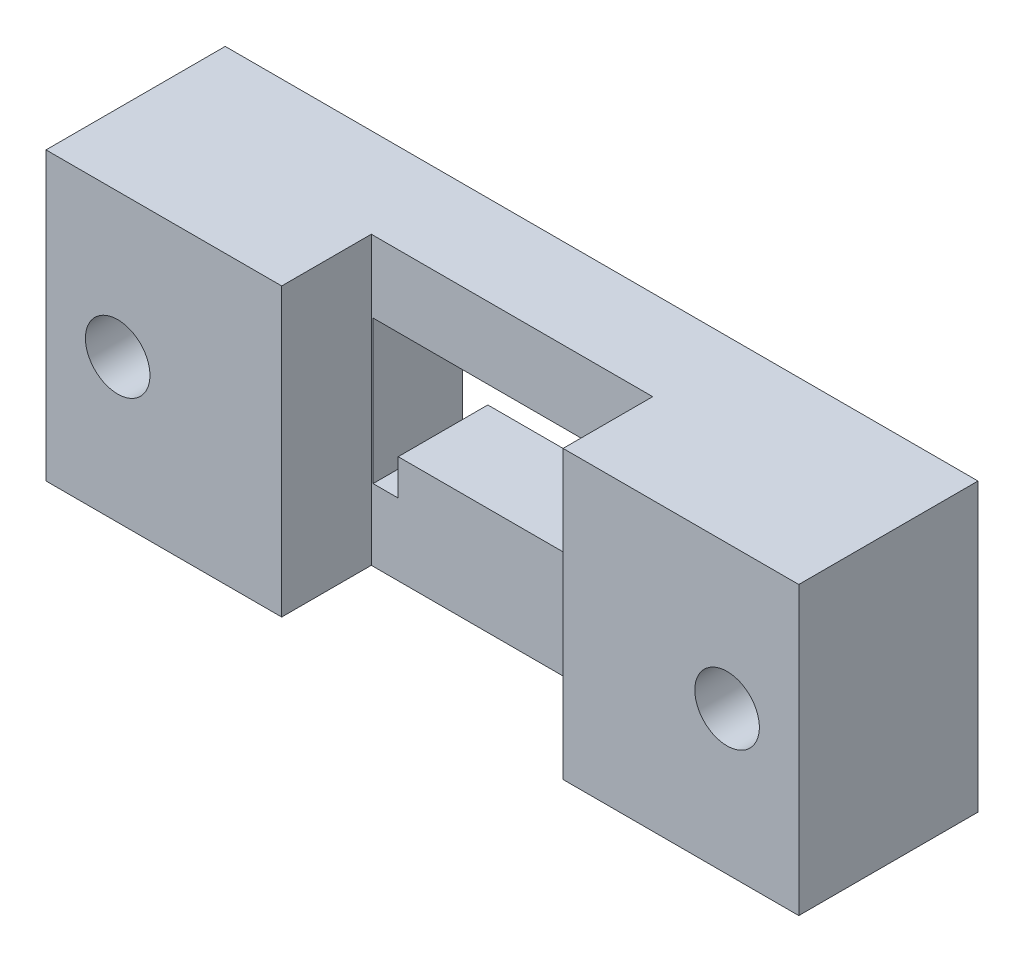
ISO-10303-21;
HEADER;
FILE_DESCRIPTION(('STEP AP214'),'2;1');
FILE_NAME('part.step','',(''),(''),'','','');
FILE_SCHEMA(('AUTOMOTIVE_DESIGN { 1 0 10303 214 1 1 1 1 }'));
ENDSEC;
DATA;
#1=APPLICATION_CONTEXT('core data for automotive mechanical design processes');
#2=APPLICATION_PROTOCOL_DEFINITION('international standard','automotive_design',2000,#1);
#3=PRODUCT_CONTEXT('',#1,'mechanical');
#4=PRODUCT('Part','Part','',(#3));
#5=PRODUCT_RELATED_PRODUCT_CATEGORY('part','',(#4));
#6=PRODUCT_DEFINITION_FORMATION('','',#4);
#7=PRODUCT_DEFINITION_CONTEXT('part definition',#1,'design');
#8=PRODUCT_DEFINITION('design','',#6,#7);
#9=PRODUCT_DEFINITION_SHAPE('','',#8);
#10=(LENGTH_UNIT() NAMED_UNIT(*) SI_UNIT(.MILLI.,.METRE.));
#11=(NAMED_UNIT(*) PLANE_ANGLE_UNIT() SI_UNIT($,.RADIAN.));
#12=(NAMED_UNIT(*) SI_UNIT($,.STERADIAN.) SOLID_ANGLE_UNIT());
#13=UNCERTAINTY_MEASURE_WITH_UNIT(LENGTH_MEASURE(1.E-05),#10,'distance_accuracy_value','');
#14=(GEOMETRIC_REPRESENTATION_CONTEXT(3) GLOBAL_UNCERTAINTY_ASSIGNED_CONTEXT((#13)) GLOBAL_UNIT_ASSIGNED_CONTEXT((#10,
#11,#12)) REPRESENTATION_CONTEXT('',''));
#15=CARTESIAN_POINT('',(0.,0.,0.));
#16=DIRECTION('',(0.,0.,1.));
#17=DIRECTION('',(1.,0.,0.));
#18=AXIS2_PLACEMENT_3D('',#15,#16,#17);
#19=CARTESIAN_POINT('',(0.,16.,10.));
#20=DIRECTION('',(0.,0.,-1.));
#21=DIRECTION('',(-1.,0.,0.));
#22=AXIS2_PLACEMENT_3D('',#19,#20,#21);
#23=PLANE('',#22);
#24=CARTESIAN_POINT('',(4.,8.,10.));
#25=DIRECTION('',(0.,0.,-1.));
#26=DIRECTION('',(-1.,0.,0.));
#27=AXIS2_PLACEMENT_3D('',#24,#25,#26);
#28=CIRCLE('',#27,1.8);
#29=CARTESIAN_POINT('',(2.20000000000001,8.,10.));
#30=VERTEX_POINT('',#29);
#31=EDGE_CURVE('E174',#30,#30,#28,.T.);
#32=ORIENTED_EDGE('',*,*,#31,.T.);
#33=EDGE_LOOP('',(#32));
#34=FACE_BOUND('',#33,.T.);
#35=DIRECTION('',(1.,0.,0.));
#36=VECTOR('',#35,1.);
#37=CARTESIAN_POINT('',(0.,0.,10.));
#38=LINE('',#37,#36);
#39=CARTESIAN_POINT('',(0.,0.,10.));
#40=VERTEX_POINT('',#39);
#41=CARTESIAN_POINT('',(13.15,0.,10.));
#42=VERTEX_POINT('',#41);
#43=EDGE_CURVE('E249',#40,#42,#38,.T.);
#44=ORIENTED_EDGE('',*,*,#43,.T.);
#45=DIRECTION('',(0.,-1.,0.));
#46=VECTOR('',#45,1.);
#47=CARTESIAN_POINT('',(13.15,16.,10.));
#48=LINE('',#47,#46);
#49=CARTESIAN_POINT('',(13.15,16.,10.));
#50=VERTEX_POINT('',#49);
#51=EDGE_CURVE('E150',#50,#42,#48,.T.);
#52=ORIENTED_EDGE('',*,*,#51,.F.);
#53=DIRECTION('',(-1.,0.,0.));
#54=VECTOR('',#53,1.);
#55=CARTESIAN_POINT('',(0.,16.,10.));
#56=LINE('',#55,#54);
#57=CARTESIAN_POINT('',(0.,16.,10.));
#58=VERTEX_POINT('',#57);
#59=EDGE_CURVE('E253',#50,#58,#56,.T.);
#60=ORIENTED_EDGE('',*,*,#59,.T.);
#61=DIRECTION('',(0.,-1.,0.));
#62=VECTOR('',#61,1.);
#63=CARTESIAN_POINT('',(0.,0.,10.));
#64=LINE('',#63,#62);
#65=EDGE_CURVE('E244',#58,#40,#64,.T.);
#66=ORIENTED_EDGE('',*,*,#65,.T.);
#67=EDGE_LOOP('',(#44,#52,#60,#66));
#68=FACE_BOUND('',#67,.T.);
#69=ADVANCED_FACE('F33',(#34,#68),#23,.F.);
#70=CARTESIAN_POINT('',(13.25,12.,0.));
#71=DIRECTION('',(-1.,0.,0.));
#72=DIRECTION('',(0.,0.,1.));
#73=AXIS2_PLACEMENT_3D('',#70,#71,#72);
#74=PLANE('',#73);
#75=DIRECTION('',(0.,1.,0.));
#76=VECTOR('',#75,1.);
#77=CARTESIAN_POINT('',(13.25,12.,5.));
#78=LINE('',#77,#76);
#79=CARTESIAN_POINT('',(13.25,4.,5.));
#80=VERTEX_POINT('',#79);
#81=CARTESIAN_POINT('',(13.25,12.,5.));
#82=VERTEX_POINT('',#81);
#83=EDGE_CURVE('E193',#80,#82,#78,.T.);
#84=ORIENTED_EDGE('',*,*,#83,.F.);
#85=DIRECTION('',(0.,0.,1.));
#86=VECTOR('',#85,1.);
#87=CARTESIAN_POINT('',(13.25,4.,0.));
#88=LINE('',#87,#86);
#89=CARTESIAN_POINT('',(13.25,4.,0.));
#90=VERTEX_POINT('',#89);
#91=EDGE_CURVE('E219',#90,#80,#88,.T.);
#92=ORIENTED_EDGE('',*,*,#91,.F.);
#93=DIRECTION('',(0.,-1.,0.));
#94=VECTOR('',#93,1.);
#95=CARTESIAN_POINT('',(13.25,12.,0.));
#96=LINE('',#95,#94);
#97=CARTESIAN_POINT('',(13.25,12.,0.));
#98=VERTEX_POINT('',#97);
#99=EDGE_CURVE('E195',#98,#90,#96,.T.);
#100=ORIENTED_EDGE('',*,*,#99,.F.);
#101=DIRECTION('',(0.,0.,1.));
#102=VECTOR('',#101,1.);
#103=CARTESIAN_POINT('',(13.25,12.,0.));
#104=LINE('',#103,#102);
#105=EDGE_CURVE('E220',#98,#82,#104,.T.);
#106=ORIENTED_EDGE('',*,*,#105,.T.);
#107=EDGE_LOOP('',(#84,#92,#100,#106));
#108=FACE_BOUND('',#107,.T.);
#109=ADVANCED_FACE('F296',(#108),#74,.F.);
#110=CARTESIAN_POINT('',(28.75,12.,0.));
#111=DIRECTION('',(0.,1.,0.));
#112=DIRECTION('',(-1.,0.,0.));
#113=AXIS2_PLACEMENT_3D('',#110,#111,#112);
#114=PLANE('',#113);
#115=DIRECTION('',(1.,0.,0.));
#116=VECTOR('',#115,1.);
#117=CARTESIAN_POINT('',(28.75,12.,5.));
#118=LINE('',#117,#116);
#119=CARTESIAN_POINT('',(28.75,12.,5.));
#120=VERTEX_POINT('',#119);
#121=EDGE_CURVE('E191',#82,#120,#118,.T.);
#122=ORIENTED_EDGE('',*,*,#121,.F.);
#123=ORIENTED_EDGE('',*,*,#105,.F.);
#124=DIRECTION('',(-1.,0.,0.));
#125=VECTOR('',#124,1.);
#126=CARTESIAN_POINT('',(28.75,12.,0.));
#127=LINE('',#126,#125);
#128=CARTESIAN_POINT('',(28.75,12.,0.));
#129=VERTEX_POINT('',#128);
#130=EDGE_CURVE('E216',#129,#98,#127,.T.);
#131=ORIENTED_EDGE('',*,*,#130,.F.);
#132=DIRECTION('',(0.,0.,1.));
#133=VECTOR('',#132,1.);
#134=CARTESIAN_POINT('',(28.75,12.,0.));
#135=LINE('',#134,#133);
#136=EDGE_CURVE('E224',#129,#120,#135,.T.);
#137=ORIENTED_EDGE('',*,*,#136,.T.);
#138=EDGE_LOOP('',(#122,#123,#131,#137));
#139=FACE_BOUND('',#138,.T.);
#140=ADVANCED_FACE('F302',(#139),#114,.F.);
#141=CARTESIAN_POINT('',(28.75,12.,0.));
#142=DIRECTION('',(1.,0.,0.));
#143=DIRECTION('',(0.,0.,-1.));
#144=AXIS2_PLACEMENT_3D('',#141,#142,#143);
#145=PLANE('',#144);
#146=DIRECTION('',(0.,-1.,0.));
#147=VECTOR('',#146,1.);
#148=CARTESIAN_POINT('',(28.75,12.,5.));
#149=LINE('',#148,#147);
#150=CARTESIAN_POINT('',(28.75,4.,5.));
#151=VERTEX_POINT('',#150);
#152=EDGE_CURVE('E189',#120,#151,#149,.T.);
#153=ORIENTED_EDGE('',*,*,#152,.F.);
#154=ORIENTED_EDGE('',*,*,#136,.F.);
#155=DIRECTION('',(0.,1.,0.));
#156=VECTOR('',#155,1.);
#157=CARTESIAN_POINT('',(28.75,12.,0.));
#158=LINE('',#157,#156);
#159=CARTESIAN_POINT('',(28.75,4.,0.));
#160=VERTEX_POINT('',#159);
#161=EDGE_CURVE('E213',#160,#129,#158,.T.);
#162=ORIENTED_EDGE('',*,*,#161,.F.);
#163=DIRECTION('',(0.,0.,1.));
#164=VECTOR('',#163,1.);
#165=CARTESIAN_POINT('',(28.75,4.,0.));
#166=LINE('',#165,#164);
#167=EDGE_CURVE('E227',#160,#151,#166,.T.);
#168=ORIENTED_EDGE('',*,*,#167,.T.);
#169=EDGE_LOOP('',(#153,#154,#162,#168));
#170=FACE_BOUND('',#169,.T.);
#171=ADVANCED_FACE('F380',(#170),#145,.F.);
#172=CARTESIAN_POINT('',(28.75,4.,0.));
#173=DIRECTION('',(0.,-1.,0.));
#174=DIRECTION('',(1.,0.,0.));
#175=AXIS2_PLACEMENT_3D('',#172,#173,#174);
#176=PLANE('',#175);
#177=DIRECTION('',(-1.,0.,0.));
#178=VECTOR('',#177,1.);
#179=CARTESIAN_POINT('',(28.75,4.,5.));
#180=LINE('',#179,#178);
#181=CARTESIAN_POINT('',(27.35,4.,5.));
#182=VERTEX_POINT('',#181);
#183=EDGE_CURVE('E187',#151,#182,#180,.T.);
#184=ORIENTED_EDGE('',*,*,#183,.F.);
#185=ORIENTED_EDGE('',*,*,#167,.F.);
#186=DIRECTION('',(1.,0.,0.));
#187=VECTOR('',#186,1.);
#188=CARTESIAN_POINT('',(28.75,4.,0.));
#189=LINE('',#188,#187);
#190=CARTESIAN_POINT('',(27.35,4.,0.));
#191=VERTEX_POINT('',#190);
#192=EDGE_CURVE('E210',#191,#160,#189,.T.);
#193=ORIENTED_EDGE('',*,*,#192,.F.);
#194=DIRECTION('',(0.,0.,1.));
#195=VECTOR('',#194,1.);
#196=CARTESIAN_POINT('',(27.35,4.,0.));
#197=LINE('',#196,#195);
#198=EDGE_CURVE('E230',#191,#182,#197,.T.);
#199=ORIENTED_EDGE('',*,*,#198,.T.);
#200=EDGE_LOOP('',(#184,#185,#193,#199));
#201=FACE_BOUND('',#200,.T.);
#202=ADVANCED_FACE('F376',(#201),#176,.F.);
#203=CARTESIAN_POINT('',(27.35,4.,0.));
#204=DIRECTION('',(-1.,0.,0.));
#205=DIRECTION('',(0.,0.,1.));
#206=AXIS2_PLACEMENT_3D('',#203,#204,#205);
#207=PLANE('',#206);
#208=DIRECTION('',(0.,1.,0.));
#209=VECTOR('',#208,1.);
#210=CARTESIAN_POINT('',(27.35,4.,5.));
#211=LINE('',#210,#209);
#212=CARTESIAN_POINT('',(27.35,6.,5.));
#213=VERTEX_POINT('',#212);
#214=EDGE_CURVE('E185',#182,#213,#211,.T.);
#215=ORIENTED_EDGE('',*,*,#214,.F.);
#216=ORIENTED_EDGE('',*,*,#198,.F.);
#217=DIRECTION('',(0.,-1.,0.));
#218=VECTOR('',#217,1.);
#219=CARTESIAN_POINT('',(27.35,4.,0.));
#220=LINE('',#219,#218);
#221=CARTESIAN_POINT('',(27.35,6.,0.));
#222=VERTEX_POINT('',#221);
#223=EDGE_CURVE('E207',#222,#191,#220,.T.);
#224=ORIENTED_EDGE('',*,*,#223,.F.);
#225=DIRECTION('',(0.,0.,1.));
#226=VECTOR('',#225,1.);
#227=CARTESIAN_POINT('',(27.35,6.,0.));
#228=LINE('',#227,#226);
#229=EDGE_CURVE('E233',#222,#213,#228,.T.);
#230=ORIENTED_EDGE('',*,*,#229,.T.);
#231=EDGE_LOOP('',(#215,#216,#224,#230));
#232=FACE_BOUND('',#231,.T.);
#233=ADVANCED_FACE('F372',(#232),#207,.F.);
#234=CARTESIAN_POINT('',(14.65,6.,0.));
#235=DIRECTION('',(0.,-1.,0.));
#236=DIRECTION('',(1.,0.,0.));
#237=AXIS2_PLACEMENT_3D('',#234,#235,#236);
#238=PLANE('',#237);
#239=DIRECTION('',(-1.,0.,0.));
#240=VECTOR('',#239,1.);
#241=CARTESIAN_POINT('',(14.65,6.,5.));
#242=LINE('',#241,#240);
#243=CARTESIAN_POINT('',(14.65,6.,5.));
#244=VERTEX_POINT('',#243);
#245=EDGE_CURVE('E183',#213,#244,#242,.T.);
#246=ORIENTED_EDGE('',*,*,#245,.F.);
#247=ORIENTED_EDGE('',*,*,#229,.F.);
#248=DIRECTION('',(1.,0.,0.));
#249=VECTOR('',#248,1.);
#250=CARTESIAN_POINT('',(14.65,6.,0.));
#251=LINE('',#250,#249);
#252=CARTESIAN_POINT('',(14.65,6.,0.));
#253=VERTEX_POINT('',#252);
#254=EDGE_CURVE('E204',#253,#222,#251,.T.);
#255=ORIENTED_EDGE('',*,*,#254,.F.);
#256=DIRECTION('',(0.,0.,1.));
#257=VECTOR('',#256,1.);
#258=CARTESIAN_POINT('',(14.65,6.,0.));
#259=LINE('',#258,#257);
#260=EDGE_CURVE('E236',#253,#244,#259,.T.);
#261=ORIENTED_EDGE('',*,*,#260,.T.);
#262=EDGE_LOOP('',(#246,#247,#255,#261));
#263=FACE_BOUND('',#262,.T.);
#264=ADVANCED_FACE('F369',(#263),#238,.F.);
#265=CARTESIAN_POINT('',(14.65,4.,0.));
#266=DIRECTION('',(1.,0.,0.));
#267=DIRECTION('',(0.,0.,-1.));
#268=AXIS2_PLACEMENT_3D('',#265,#266,#267);
#269=PLANE('',#268);
#270=DIRECTION('',(0.,-1.,0.));
#271=VECTOR('',#270,1.);
#272=CARTESIAN_POINT('',(14.65,4.,5.));
#273=LINE('',#272,#271);
#274=CARTESIAN_POINT('',(14.65,4.,5.));
#275=VERTEX_POINT('',#274);
#276=EDGE_CURVE('E55',#244,#275,#273,.T.);
#277=ORIENTED_EDGE('',*,*,#276,.F.);
#278=ORIENTED_EDGE('',*,*,#260,.F.);
#279=DIRECTION('',(0.,1.,0.));
#280=VECTOR('',#279,1.);
#281=CARTESIAN_POINT('',(14.65,4.,0.));
#282=LINE('',#281,#280);
#283=CARTESIAN_POINT('',(14.65,4.,0.));
#284=VERTEX_POINT('',#283);
#285=EDGE_CURVE('E201',#284,#253,#282,.T.);
#286=ORIENTED_EDGE('',*,*,#285,.F.);
#287=DIRECTION('',(0.,0.,1.));
#288=VECTOR('',#287,1.);
#289=CARTESIAN_POINT('',(14.65,4.,0.));
#290=LINE('',#289,#288);
#291=EDGE_CURVE('E239',#284,#275,#290,.T.);
#292=ORIENTED_EDGE('',*,*,#291,.T.);
#293=EDGE_LOOP('',(#277,#278,#286,#292));
#294=FACE_BOUND('',#293,.T.);
#295=ADVANCED_FACE('F364',(#294),#269,.F.);
#296=CARTESIAN_POINT('',(13.25,4.,0.));
#297=DIRECTION('',(0.,-1.,0.));
#298=DIRECTION('',(1.,0.,0.));
#299=AXIS2_PLACEMENT_3D('',#296,#297,#298);
#300=PLANE('',#299);
#301=DIRECTION('',(-1.,0.,0.));
#302=VECTOR('',#301,1.);
#303=CARTESIAN_POINT('',(13.25,4.,5.));
#304=LINE('',#303,#302);
#305=EDGE_CURVE('E11',#275,#80,#304,.T.);
#306=ORIENTED_EDGE('',*,*,#305,.F.);
#307=ORIENTED_EDGE('',*,*,#291,.F.);
#308=DIRECTION('',(1.,0.,0.));
#309=VECTOR('',#308,1.);
#310=CARTESIAN_POINT('',(13.25,4.,0.));
#311=LINE('',#310,#309);
#312=EDGE_CURVE('E198',#90,#284,#311,.T.);
#313=ORIENTED_EDGE('',*,*,#312,.F.);
#314=ORIENTED_EDGE('',*,*,#91,.T.);
#315=EDGE_LOOP('',(#306,#307,#313,#314));
#316=FACE_BOUND('',#315,.T.);
#317=ADVANCED_FACE('F362',(#316),#300,.F.);
#318=CARTESIAN_POINT('',(0.,0.,10.));
#319=DIRECTION('',(1.,0.,0.));
#320=DIRECTION('',(0.,0.,-1.));
#321=AXIS2_PLACEMENT_3D('',#318,#319,#320);
#322=PLANE('',#321);
#323=DIRECTION('',(0.,-1.,0.));
#324=VECTOR('',#323,1.);
#325=CARTESIAN_POINT('',(0.,0.,0.));
#326=LINE('',#325,#324);
#327=CARTESIAN_POINT('',(0.,16.,0.));
#328=VERTEX_POINT('',#327);
#329=CARTESIAN_POINT('',(0.,0.,0.));
#330=VERTEX_POINT('',#329);
#331=EDGE_CURVE('E223',#328,#330,#326,.T.);
#332=ORIENTED_EDGE('',*,*,#331,.T.);
#333=DIRECTION('',(0.,0.,-1.));
#334=VECTOR('',#333,1.);
#335=CARTESIAN_POINT('',(0.,0.,10.));
#336=LINE('',#335,#334);
#337=EDGE_CURVE('E41',#40,#330,#336,.T.);
#338=ORIENTED_EDGE('',*,*,#337,.F.);
#339=ORIENTED_EDGE('',*,*,#65,.F.);
#340=DIRECTION('',(0.,0.,-1.));
#341=VECTOR('',#340,1.);
#342=CARTESIAN_POINT('',(0.,16.,10.));
#343=LINE('',#342,#341);
#344=EDGE_CURVE('E257',#58,#328,#343,.T.);
#345=ORIENTED_EDGE('',*,*,#344,.T.);
#346=EDGE_LOOP('',(#332,#338,#339,#345));
#347=FACE_BOUND('',#346,.T.);
#348=ADVANCED_FACE('F35',(#347),#322,.F.);
#349=CARTESIAN_POINT('',(0.,0.,10.));
#350=DIRECTION('',(0.,1.,0.));
#351=DIRECTION('',(0.,0.,1.));
#352=AXIS2_PLACEMENT_3D('',#349,#350,#351);
#353=PLANE('',#352);
#354=DIRECTION('',(1.,0.,0.));
#355=VECTOR('',#354,1.);
#356=CARTESIAN_POINT('',(13.15,0.,5.));
#357=LINE('',#356,#355);
#358=CARTESIAN_POINT('',(13.15,0.,5.));
#359=VERTEX_POINT('',#358);
#360=CARTESIAN_POINT('',(28.85,0.,5.));
#361=VERTEX_POINT('',#360);
#362=EDGE_CURVE('E160',#359,#361,#357,.T.);
#363=ORIENTED_EDGE('',*,*,#362,.F.);
#364=DIRECTION('',(0.,0.,1.));
#365=VECTOR('',#364,1.);
#366=CARTESIAN_POINT('',(13.15,0.,5.));
#367=LINE('',#366,#365);
#368=EDGE_CURVE('E144',#359,#42,#367,.T.);
#369=ORIENTED_EDGE('',*,*,#368,.T.);
#370=ORIENTED_EDGE('',*,*,#43,.F.);
#371=ORIENTED_EDGE('',*,*,#337,.T.);
#372=DIRECTION('',(1.,0.,0.));
#373=VECTOR('',#372,1.);
#374=CARTESIAN_POINT('',(0.,0.,0.));
#375=LINE('',#374,#373);
#376=CARTESIAN_POINT('',(42.,0.,0.));
#377=VERTEX_POINT('',#376);
#378=EDGE_CURVE('E260',#330,#377,#375,.T.);
#379=ORIENTED_EDGE('',*,*,#378,.T.);
#380=DIRECTION('',(0.,0.,-1.));
#381=VECTOR('',#380,1.);
#382=CARTESIAN_POINT('',(42.,0.,10.));
#383=LINE('',#382,#381);
#384=CARTESIAN_POINT('',(42.,0.,10.));
#385=VERTEX_POINT('',#384);
#386=EDGE_CURVE('E270',#385,#377,#383,.T.);
#387=ORIENTED_EDGE('',*,*,#386,.F.);
#388=CARTESIAN_POINT('',(28.85,0.,10.));
#389=VERTEX_POINT('',#388);
#390=EDGE_CURVE('E247',#389,#385,#38,.T.);
#391=ORIENTED_EDGE('',*,*,#390,.F.);
#392=DIRECTION('',(0.,0.,1.));
#393=VECTOR('',#392,1.);
#394=CARTESIAN_POINT('',(28.85,0.,5.));
#395=LINE('',#394,#393);
#396=EDGE_CURVE('E48',#361,#389,#395,.T.);
#397=ORIENTED_EDGE('',*,*,#396,.F.);
#398=EDGE_LOOP('',(#363,#369,#370,#371,#379,#387,#391,#397));
#399=FACE_BOUND('',#398,.T.);
#400=ADVANCED_FACE('F165',(#399),#353,.F.);
#401=CARTESIAN_POINT('',(42.,0.,10.));
#402=DIRECTION('',(-1.,0.,0.));
#403=DIRECTION('',(0.,0.,1.));
#404=AXIS2_PLACEMENT_3D('',#401,#402,#403);
#405=PLANE('',#404);
#406=DIRECTION('',(0.,1.,0.));
#407=VECTOR('',#406,1.);
#408=CARTESIAN_POINT('',(42.,0.,0.));
#409=LINE('',#408,#407);
#410=CARTESIAN_POINT('',(42.,16.,0.));
#411=VERTEX_POINT('',#410);
#412=EDGE_CURVE('E262',#377,#411,#409,.T.);
#413=ORIENTED_EDGE('',*,*,#412,.T.);
#414=DIRECTION('',(0.,0.,-1.));
#415=VECTOR('',#414,1.);
#416=CARTESIAN_POINT('',(42.,16.,10.));
#417=LINE('',#416,#415);
#418=CARTESIAN_POINT('',(42.,16.,10.));
#419=VERTEX_POINT('',#418);
#420=EDGE_CURVE('E267',#419,#411,#417,.T.);
#421=ORIENTED_EDGE('',*,*,#420,.F.);
#422=DIRECTION('',(0.,1.,0.));
#423=VECTOR('',#422,1.);
#424=CARTESIAN_POINT('',(42.,0.,10.));
#425=LINE('',#424,#423);
#426=EDGE_CURVE('E251',#385,#419,#425,.T.);
#427=ORIENTED_EDGE('',*,*,#426,.F.);
#428=ORIENTED_EDGE('',*,*,#386,.T.);
#429=EDGE_LOOP('',(#413,#421,#427,#428));
#430=FACE_BOUND('',#429,.T.);
#431=ADVANCED_FACE('F285',(#430),#405,.F.);
#432=CARTESIAN_POINT('',(0.,16.,10.));
#433=DIRECTION('',(0.,-1.,0.));
#434=DIRECTION('',(0.,0.,-1.));
#435=AXIS2_PLACEMENT_3D('',#432,#433,#434);
#436=PLANE('',#435);
#437=ORIENTED_EDGE('',*,*,#59,.F.);
#438=DIRECTION('',(0.,0.,1.));
#439=VECTOR('',#438,1.);
#440=CARTESIAN_POINT('',(13.15,16.,5.));
#441=LINE('',#440,#439);
#442=CARTESIAN_POINT('',(13.15,16.,5.));
#443=VERTEX_POINT('',#442);
#444=EDGE_CURVE('E176',#443,#50,#441,.T.);
#445=ORIENTED_EDGE('',*,*,#444,.F.);
#446=DIRECTION('',(-1.,0.,0.));
#447=VECTOR('',#446,1.);
#448=CARTESIAN_POINT('',(13.15,16.,5.));
#449=LINE('',#448,#447);
#450=CARTESIAN_POINT('',(28.85,16.,5.));
#451=VERTEX_POINT('',#450);
#452=EDGE_CURVE('E154',#451,#443,#449,.T.);
#453=ORIENTED_EDGE('',*,*,#452,.F.);
#454=DIRECTION('',(0.,0.,1.));
#455=VECTOR('',#454,1.);
#456=CARTESIAN_POINT('',(28.85,16.,5.));
#457=LINE('',#456,#455);
#458=CARTESIAN_POINT('',(28.85,16.,10.));
#459=VERTEX_POINT('',#458);
#460=EDGE_CURVE('E178',#451,#459,#457,.T.);
#461=ORIENTED_EDGE('',*,*,#460,.T.);
#462=EDGE_CURVE('E254',#419,#459,#56,.T.);
#463=ORIENTED_EDGE('',*,*,#462,.F.);
#464=ORIENTED_EDGE('',*,*,#420,.T.);
#465=DIRECTION('',(-1.,0.,0.));
#466=VECTOR('',#465,1.);
#467=CARTESIAN_POINT('',(0.,16.,0.));
#468=LINE('',#467,#466);
#469=EDGE_CURVE('E248',#411,#328,#468,.T.);
#470=ORIENTED_EDGE('',*,*,#469,.T.);
#471=ORIENTED_EDGE('',*,*,#344,.F.);
#472=EDGE_LOOP('',(#437,#445,#453,#461,#463,#464,#470,#471));
#473=FACE_BOUND('',#472,.T.);
#474=ADVANCED_FACE('F290',(#473),#436,.F.);
#475=CARTESIAN_POINT('',(38.,7.99999999999999,10.));
#476=DIRECTION('',(0.,0.,-1.));
#477=DIRECTION('',(-1.,0.,0.));
#478=AXIS2_PLACEMENT_3D('',#475,#476,#477);
#479=CIRCLE('',#478,1.8);
#480=CARTESIAN_POINT('',(36.2,7.99999999999999,10.));
#481=VERTEX_POINT('',#480);
#482=EDGE_CURVE('E317',#481,#481,#479,.T.);
#483=ORIENTED_EDGE('',*,*,#482,.T.);
#484=EDGE_LOOP('',(#483));
#485=FACE_BOUND('',#484,.T.);
#486=ORIENTED_EDGE('',*,*,#462,.T.);
#487=DIRECTION('',(0.,1.,0.));
#488=VECTOR('',#487,1.);
#489=CARTESIAN_POINT('',(28.85,16.,10.));
#490=LINE('',#489,#488);
#491=EDGE_CURVE('E163',#389,#459,#490,.T.);
#492=ORIENTED_EDGE('',*,*,#491,.F.);
#493=ORIENTED_EDGE('',*,*,#390,.T.);
#494=ORIENTED_EDGE('',*,*,#426,.T.);
#495=EDGE_LOOP('',(#486,#492,#493,#494));
#496=FACE_BOUND('',#495,.T.);
#497=ADVANCED_FACE('F292',(#485,#496),#23,.F.);
#498=CARTESIAN_POINT('',(0.,16.,0.));
#499=DIRECTION('',(0.,0.,-1.));
#500=DIRECTION('',(-1.,0.,0.));
#501=AXIS2_PLACEMENT_3D('',#498,#499,#500);
#502=PLANE('',#501);
#503=CARTESIAN_POINT('',(38.,7.99999999999999,0.));
#504=DIRECTION('',(0.,0.,-1.));
#505=DIRECTION('',(-1.,0.,0.));
#506=AXIS2_PLACEMENT_3D('',#503,#504,#505);
#507=CIRCLE('',#506,3.25);
#508=CARTESIAN_POINT('',(34.75,7.99999999999999,0.));
#509=VERTEX_POINT('',#508);
#510=EDGE_CURVE('E511',#509,#509,#507,.T.);
#511=ORIENTED_EDGE('',*,*,#510,.F.);
#512=EDGE_LOOP('',(#511));
#513=FACE_BOUND('',#512,.T.);
#514=CARTESIAN_POINT('',(4.,8.,0.));
#515=DIRECTION('',(0.,0.,-1.));
#516=DIRECTION('',(-1.,0.,0.));
#517=AXIS2_PLACEMENT_3D('',#514,#515,#516);
#518=CIRCLE('',#517,3.25);
#519=CARTESIAN_POINT('',(0.750000000000004,8.,0.));
#520=VERTEX_POINT('',#519);
#521=EDGE_CURVE('E319',#520,#520,#518,.T.);
#522=ORIENTED_EDGE('',*,*,#521,.F.);
#523=EDGE_LOOP('',(#522));
#524=FACE_BOUND('',#523,.T.);
#525=ORIENTED_EDGE('',*,*,#99,.T.);
#526=ORIENTED_EDGE('',*,*,#312,.T.);
#527=ORIENTED_EDGE('',*,*,#285,.T.);
#528=ORIENTED_EDGE('',*,*,#254,.T.);
#529=ORIENTED_EDGE('',*,*,#223,.T.);
#530=ORIENTED_EDGE('',*,*,#192,.T.);
#531=ORIENTED_EDGE('',*,*,#161,.T.);
#532=ORIENTED_EDGE('',*,*,#130,.T.);
#533=EDGE_LOOP('',(#525,#526,#527,#528,#529,#530,#531,#532));
#534=FACE_BOUND('',#533,.T.);
#535=ORIENTED_EDGE('',*,*,#331,.F.);
#536=ORIENTED_EDGE('',*,*,#469,.F.);
#537=ORIENTED_EDGE('',*,*,#412,.F.);
#538=ORIENTED_EDGE('',*,*,#378,.F.);
#539=EDGE_LOOP('',(#535,#536,#537,#538));
#540=FACE_BOUND('',#539,.T.);
#541=ADVANCED_FACE('F281',(#513,#524,#534,#540),#502,.T.);
#542=CARTESIAN_POINT('',(13.15,0.,5.));
#543=DIRECTION('',(0.,0.,1.));
#544=DIRECTION('',(1.,0.,0.));
#545=AXIS2_PLACEMENT_3D('',#542,#543,#544);
#546=PLANE('',#545);
#547=DIRECTION('',(0.,-1.,0.));
#548=VECTOR('',#547,1.);
#549=CARTESIAN_POINT('',(13.15,16.,5.));
#550=LINE('',#549,#548);
#551=EDGE_CURVE('E147',#443,#359,#550,.T.);
#552=ORIENTED_EDGE('',*,*,#551,.T.);
#553=ORIENTED_EDGE('',*,*,#362,.T.);
#554=DIRECTION('',(0.,1.,0.));
#555=VECTOR('',#554,1.);
#556=CARTESIAN_POINT('',(28.85,16.,5.));
#557=LINE('',#556,#555);
#558=EDGE_CURVE('E167',#361,#451,#557,.T.);
#559=ORIENTED_EDGE('',*,*,#558,.T.);
#560=ORIENTED_EDGE('',*,*,#452,.T.);
#561=EDGE_LOOP('',(#552,#553,#559,#560));
#562=FACE_BOUND('',#561,.T.);
#563=ORIENTED_EDGE('',*,*,#83,.T.);
#564=ORIENTED_EDGE('',*,*,#121,.T.);
#565=ORIENTED_EDGE('',*,*,#152,.T.);
#566=ORIENTED_EDGE('',*,*,#183,.T.);
#567=ORIENTED_EDGE('',*,*,#214,.T.);
#568=ORIENTED_EDGE('',*,*,#245,.T.);
#569=ORIENTED_EDGE('',*,*,#276,.T.);
#570=ORIENTED_EDGE('',*,*,#305,.T.);
#571=EDGE_LOOP('',(#563,#564,#565,#566,#567,#568,#569,#570));
#572=FACE_BOUND('',#571,.T.);
#573=ADVANCED_FACE('F158',(#562,#572),#546,.T.);
#574=CARTESIAN_POINT('',(13.15,16.,5.));
#575=DIRECTION('',(-1.,0.,0.));
#576=DIRECTION('',(0.,-1.,0.));
#577=AXIS2_PLACEMENT_3D('',#574,#575,#576);
#578=PLANE('',#577);
#579=ORIENTED_EDGE('',*,*,#51,.T.);
#580=ORIENTED_EDGE('',*,*,#368,.F.);
#581=ORIENTED_EDGE('',*,*,#551,.F.);
#582=ORIENTED_EDGE('',*,*,#444,.T.);
#583=EDGE_LOOP('',(#579,#580,#581,#582));
#584=FACE_BOUND('',#583,.T.);
#585=ADVANCED_FACE('F146',(#584),#578,.F.);
#586=CARTESIAN_POINT('',(28.85,16.,5.));
#587=DIRECTION('',(1.,0.,0.));
#588=DIRECTION('',(0.,0.,-1.));
#589=AXIS2_PLACEMENT_3D('',#586,#587,#588);
#590=PLANE('',#589);
#591=ORIENTED_EDGE('',*,*,#491,.T.);
#592=ORIENTED_EDGE('',*,*,#460,.F.);
#593=ORIENTED_EDGE('',*,*,#558,.F.);
#594=ORIENTED_EDGE('',*,*,#396,.T.);
#595=EDGE_LOOP('',(#591,#592,#593,#594));
#596=FACE_BOUND('',#595,.T.);
#597=ADVANCED_FACE('F293',(#596),#590,.F.);
#598=CARTESIAN_POINT('',(4.,8.,0.));
#599=DIRECTION('',(0.,0.,-1.));
#600=DIRECTION('',(-1.,0.,0.));
#601=AXIS2_PLACEMENT_3D('',#598,#599,#600);
#602=CYLINDRICAL_SURFACE('',#601,1.8);
#603=ORIENTED_EDGE('',*,*,#31,.F.);
#604=EDGE_LOOP('',(#603));
#605=FACE_BOUND('',#604,.T.);
#606=CARTESIAN_POINT('',(4.,8.,3.));
#607=DIRECTION('',(0.,0.,-1.));
#608=DIRECTION('',(-1.,0.,0.));
#609=AXIS2_PLACEMENT_3D('',#606,#607,#608);
#610=CIRCLE('',#609,1.8);
#611=CARTESIAN_POINT('',(2.2,8.,3.));
#612=VERTEX_POINT('',#611);
#613=EDGE_CURVE('E332',#612,#612,#610,.T.);
#614=ORIENTED_EDGE('',*,*,#613,.T.);
#615=EDGE_LOOP('',(#614));
#616=FACE_BOUND('',#615,.T.);
#617=ADVANCED_FACE('F336',(#605,#616),#602,.F.);
#618=CARTESIAN_POINT('',(5.8,8.,3.));
#619=DIRECTION('',(0.,0.,1.));
#620=DIRECTION('',(1.,0.,0.));
#621=AXIS2_PLACEMENT_3D('',#618,#619,#620);
#622=PLANE('',#621);
#623=ORIENTED_EDGE('',*,*,#613,.F.);
#624=EDGE_LOOP('',(#623));
#625=FACE_BOUND('',#624,.T.);
#626=CARTESIAN_POINT('',(4.,8.,3.));
#627=DIRECTION('',(0.,0.,-1.));
#628=DIRECTION('',(-1.,0.,0.));
#629=AXIS2_PLACEMENT_3D('',#626,#627,#628);
#630=CIRCLE('',#629,3.25);
#631=CARTESIAN_POINT('',(0.750000000000004,8.,3.));
#632=VERTEX_POINT('',#631);
#633=EDGE_CURVE('E323',#632,#632,#630,.T.);
#634=ORIENTED_EDGE('',*,*,#633,.T.);
#635=EDGE_LOOP('',(#634));
#636=FACE_BOUND('',#635,.T.);
#637=ADVANCED_FACE('F339',(#625,#636),#622,.F.);
#638=CARTESIAN_POINT('',(4.,8.,0.));
#639=DIRECTION('',(0.,0.,-1.));
#640=DIRECTION('',(-1.,0.,0.));
#641=AXIS2_PLACEMENT_3D('',#638,#639,#640);
#642=CYLINDRICAL_SURFACE('',#641,3.25);
#643=ORIENTED_EDGE('',*,*,#633,.F.);
#644=EDGE_LOOP('',(#643));
#645=FACE_BOUND('',#644,.T.);
#646=ORIENTED_EDGE('',*,*,#521,.T.);
#647=EDGE_LOOP('',(#646));
#648=FACE_BOUND('',#647,.T.);
#649=ADVANCED_FACE('F345',(#645,#648),#642,.F.);
#650=CARTESIAN_POINT('',(38.,7.99999999999999,0.));
#651=DIRECTION('',(0.,0.,-1.));
#652=DIRECTION('',(-1.,0.,0.));
#653=AXIS2_PLACEMENT_3D('',#650,#651,#652);
#654=CYLINDRICAL_SURFACE('',#653,1.8);
#655=ORIENTED_EDGE('',*,*,#482,.F.);
#656=EDGE_LOOP('',(#655));
#657=FACE_BOUND('',#656,.T.);
#658=CARTESIAN_POINT('',(38.,7.99999999999999,3.));
#659=DIRECTION('',(0.,0.,-1.));
#660=DIRECTION('',(-1.,0.,0.));
#661=AXIS2_PLACEMENT_3D('',#658,#659,#660);
#662=CIRCLE('',#661,1.8);
#663=CARTESIAN_POINT('',(36.2,7.99999999999999,3.));
#664=VERTEX_POINT('',#663);
#665=EDGE_CURVE('E320',#664,#664,#662,.T.);
#666=ORIENTED_EDGE('',*,*,#665,.T.);
#667=EDGE_LOOP('',(#666));
#668=FACE_BOUND('',#667,.T.);
#669=ADVANCED_FACE('F351',(#657,#668),#654,.F.);
#670=CARTESIAN_POINT('',(39.8,7.99999999999999,3.));
#671=DIRECTION('',(0.,0.,1.));
#672=DIRECTION('',(1.,0.,0.));
#673=AXIS2_PLACEMENT_3D('',#670,#671,#672);
#674=PLANE('',#673);
#675=ORIENTED_EDGE('',*,*,#665,.F.);
#676=EDGE_LOOP('',(#675));
#677=FACE_BOUND('',#676,.T.);
#678=CARTESIAN_POINT('',(38.,7.99999999999999,3.));
#679=DIRECTION('',(0.,0.,-1.));
#680=DIRECTION('',(-1.,0.,0.));
#681=AXIS2_PLACEMENT_3D('',#678,#679,#680);
#682=CIRCLE('',#681,3.25);
#683=CARTESIAN_POINT('',(34.75,7.99999999999999,3.));
#684=VERTEX_POINT('',#683);
#685=EDGE_CURVE('E326',#684,#684,#682,.T.);
#686=ORIENTED_EDGE('',*,*,#685,.T.);
#687=EDGE_LOOP('',(#686));
#688=FACE_BOUND('',#687,.T.);
#689=ADVANCED_FACE('F483',(#677,#688),#674,.F.);
#690=CARTESIAN_POINT('',(38.,7.99999999999999,0.));
#691=DIRECTION('',(0.,0.,-1.));
#692=DIRECTION('',(-1.,0.,0.));
#693=AXIS2_PLACEMENT_3D('',#690,#691,#692);
#694=CYLINDRICAL_SURFACE('',#693,3.25);
#695=ORIENTED_EDGE('',*,*,#685,.F.);
#696=EDGE_LOOP('',(#695));
#697=FACE_BOUND('',#696,.T.);
#698=ORIENTED_EDGE('',*,*,#510,.T.);
#699=EDGE_LOOP('',(#698));
#700=FACE_BOUND('',#699,.T.);
#701=ADVANCED_FACE('F492',(#697,#700),#694,.F.);
#702=CLOSED_SHELL('',(#69,#109,#140,#171,#202,#233,#264,#295,#317,#348,#400,#431,#474,#497,#541,
#573,#585,#597,#617,#637,#649,#669,#689,#701));
#703=MANIFOLD_SOLID_BREP('B2',#702);
#704=ADVANCED_BREP_SHAPE_REPRESENTATION('',(#18,#703),#14);
#705=SHAPE_DEFINITION_REPRESENTATION(#9,#704);
ENDSEC;
END-ISO-10303-21;
